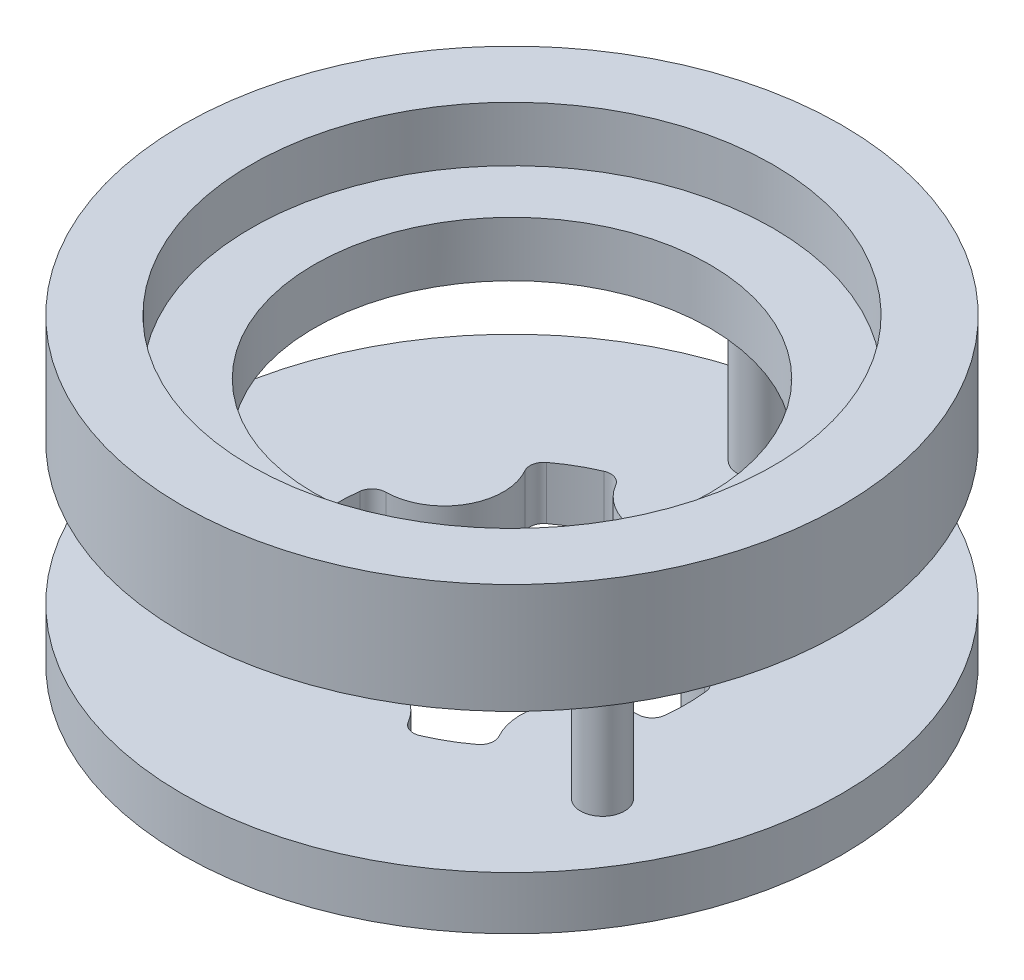
ISO-10303-21;
HEADER;
FILE_DESCRIPTION(('STEP AP214'),'2;1');
FILE_NAME('part.step','',(''),(''),'','','');
FILE_SCHEMA(('AUTOMOTIVE_DESIGN { 1 0 10303 214 1 1 1 1 }'));
ENDSEC;
DATA;
#1=APPLICATION_CONTEXT('core data for automotive mechanical design processes');
#2=APPLICATION_PROTOCOL_DEFINITION('international standard','automotive_design',2000,#1);
#3=PRODUCT_CONTEXT('',#1,'mechanical');
#4=PRODUCT('Part','Part','',(#3));
#5=PRODUCT_RELATED_PRODUCT_CATEGORY('part','',(#4));
#6=PRODUCT_DEFINITION_FORMATION('','',#4);
#7=PRODUCT_DEFINITION_CONTEXT('part definition',#1,'design');
#8=PRODUCT_DEFINITION('design','',#6,#7);
#9=PRODUCT_DEFINITION_SHAPE('','',#8);
#10=(LENGTH_UNIT() NAMED_UNIT(*) SI_UNIT(.MILLI.,.METRE.));
#11=(NAMED_UNIT(*) PLANE_ANGLE_UNIT() SI_UNIT($,.RADIAN.));
#12=(NAMED_UNIT(*) SI_UNIT($,.STERADIAN.) SOLID_ANGLE_UNIT());
#13=UNCERTAINTY_MEASURE_WITH_UNIT(LENGTH_MEASURE(1.E-05),#10,'distance_accuracy_value','');
#14=(GEOMETRIC_REPRESENTATION_CONTEXT(3) GLOBAL_UNCERTAINTY_ASSIGNED_CONTEXT((#13)) GLOBAL_UNIT_ASSIGNED_CONTEXT((#10,
#11,#12)) REPRESENTATION_CONTEXT('',''));
#15=CARTESIAN_POINT('',(0.,0.,0.));
#16=DIRECTION('',(0.,0.,1.));
#17=DIRECTION('',(1.,0.,0.));
#18=AXIS2_PLACEMENT_3D('',#15,#16,#17);
#19=CARTESIAN_POINT('',(0.,55.052,0.));
#20=DIRECTION('',(0.,-1.,0.));
#21=DIRECTION('',(0.,0.,-1.));
#22=AXIS2_PLACEMENT_3D('',#19,#20,#21);
#23=CYLINDRICAL_SURFACE('',#22,36.);
#24=CARTESIAN_POINT('',(0.,35.052,0.));
#25=DIRECTION('',(0.,-1.,0.));
#26=DIRECTION('',(0.,0.,-1.));
#27=AXIS2_PLACEMENT_3D('',#24,#25,#26);
#28=CIRCLE('',#27,36.);
#29=CARTESIAN_POINT('',(0.,35.052,-36.));
#30=VERTEX_POINT('',#29);
#31=EDGE_CURVE('E286',#30,#30,#28,.T.);
#32=ORIENTED_EDGE('',*,*,#31,.T.);
#33=EDGE_LOOP('',(#32));
#34=FACE_BOUND('',#33,.T.);
#35=CARTESIAN_POINT('',(0.,45.052,0.));
#36=DIRECTION('',(0.,1.,0.));
#37=DIRECTION('',(0.,0.,1.));
#38=AXIS2_PLACEMENT_3D('',#35,#36,#37);
#39=CIRCLE('',#38,36.);
#40=CARTESIAN_POINT('',(0.,45.052,36.));
#41=VERTEX_POINT('',#40);
#42=EDGE_CURVE('E282',#41,#41,#39,.F.);
#43=ORIENTED_EDGE('',*,*,#42,.F.);
#44=EDGE_LOOP('',(#43));
#45=FACE_BOUND('',#44,.T.);
#46=ADVANCED_FACE('F45',(#34,#45),#23,.F.);
#47=CARTESIAN_POINT('',(0.,9.652,0.));
#48=DIRECTION('',(0.,-1.,0.));
#49=DIRECTION('',(0.,0.,-1.));
#50=AXIS2_PLACEMENT_3D('',#47,#48,#49);
#51=CYLINDRICAL_SURFACE('',#50,31.7499999999997);
#52=CARTESIAN_POINT('',(0.,0.,0.));
#53=DIRECTION('',(0.,1.,0.));
#54=DIRECTION('',(0.,0.,1.));
#55=AXIS2_PLACEMENT_3D('',#52,#53,#54);
#56=CIRCLE('',#55,31.7499999999997);
#57=CARTESIAN_POINT('',(-19.0652165159659,0.,25.3885804880722));
#58=VERTEX_POINT('',#57);
#59=CARTESIAN_POINT('',(-12.4545474107137,0.,29.2052520755132));
#60=VERTEX_POINT('',#59);
#61=EDGE_CURVE('E474',#58,#60,#56,.T.);
#62=ORIENTED_EDGE('',*,*,#61,.F.);
#63=DIRECTION('',(0.,-1.,0.));
#64=VECTOR('',#63,1.);
#65=CARTESIAN_POINT('',(-19.0652165159659,9.652,25.3885804880723));
#66=LINE('',#65,#64);
#67=CARTESIAN_POINT('',(-19.0652165159659,9.652,25.3885804880722));
#68=VERTEX_POINT('',#67);
#69=EDGE_CURVE('E307',#58,#68,#66,.F.);
#70=ORIENTED_EDGE('',*,*,#69,.T.);
#71=CARTESIAN_POINT('',(0.,9.652,0.));
#72=DIRECTION('',(0.,1.,0.));
#73=DIRECTION('',(0.,0.,1.));
#74=AXIS2_PLACEMENT_3D('',#71,#72,#73);
#75=CIRCLE('',#74,31.7499999999997);
#76=CARTESIAN_POINT('',(-12.4545474107137,9.652,29.2052520755132));
#77=VERTEX_POINT('',#76);
#78=EDGE_CURVE('E281',#68,#77,#75,.T.);
#79=ORIENTED_EDGE('',*,*,#78,.T.);
#80=DIRECTION('',(0.,-1.,0.));
#81=VECTOR('',#80,1.);
#82=CARTESIAN_POINT('',(-12.4545474107137,9.652,29.2052520755132));
#83=LINE('',#82,#81);
#84=EDGE_CURVE('E303',#77,#60,#83,.T.);
#85=ORIENTED_EDGE('',*,*,#84,.T.);
#86=EDGE_LOOP('',(#62,#70,#79,#85));
#87=FACE_BOUND('',#86,.T.);
#88=ADVANCED_FACE('F580',(#87),#51,.F.);
#89=CARTESIAN_POINT('',(-29.1143354501116,9.652,16.8091694093988));
#90=DIRECTION('',(0.,-1.,0.));
#91=DIRECTION('',(0.,0.,-1.));
#92=AXIS2_PLACEMENT_3D('',#89,#90,#91);
#93=CYLINDRICAL_SURFACE('',#92,10.7583388187981);
#94=CARTESIAN_POINT('',(-29.1143354501116,0.,16.8091694093988));
#95=DIRECTION('',(0.,1.,0.));
#96=DIRECTION('',(0.,0.,1.));
#97=AXIS2_PLACEMENT_3D('',#94,#95,#96);
#98=CIRCLE('',#97,10.7583388187981);
#99=CARTESIAN_POINT('',(-19.7507124641699,0.,22.1067555311341));
#100=VERTEX_POINT('',#99);
#101=CARTESIAN_POINT('',(-29.0203681172994,0.,6.05124097124576));
#102=VERTEX_POINT('',#101);
#103=EDGE_CURVE('E246',#100,#102,#98,.T.);
#104=ORIENTED_EDGE('',*,*,#103,.T.);
#105=DIRECTION('',(0.,-1.,0.));
#106=VECTOR('',#105,1.);
#107=CARTESIAN_POINT('',(-29.0203681172994,9.652,6.05124097124576));
#108=LINE('',#107,#106);
#109=CARTESIAN_POINT('',(-29.0203681172994,9.652,6.05124097124576));
#110=VERTEX_POINT('',#109);
#111=EDGE_CURVE('E300',#102,#110,#108,.F.);
#112=ORIENTED_EDGE('',*,*,#111,.T.);
#113=CARTESIAN_POINT('',(-29.1143354501116,9.652,16.8091694093988));
#114=DIRECTION('',(0.,1.,0.));
#115=DIRECTION('',(0.,0.,1.));
#116=AXIS2_PLACEMENT_3D('',#113,#114,#115);
#117=CIRCLE('',#116,10.7583388187981);
#118=CARTESIAN_POINT('',(-19.7507124641699,9.652,22.1067555311341));
#119=VERTEX_POINT('',#118);
#120=EDGE_CURVE('E493',#119,#110,#117,.T.);
#121=ORIENTED_EDGE('',*,*,#120,.F.);
#122=DIRECTION('',(0.,-1.,0.));
#123=VECTOR('',#122,1.);
#124=CARTESIAN_POINT('',(-19.7507124641699,9.652,22.1067555311341));
#125=LINE('',#124,#123);
#126=EDGE_CURVE('E296',#119,#100,#125,.T.);
#127=ORIENTED_EDGE('',*,*,#126,.T.);
#128=EDGE_LOOP('',(#104,#112,#121,#127));
#129=FACE_BOUND('',#128,.T.);
#130=ADVANCED_FACE('F482',(#129),#93,.T.);
#131=CARTESIAN_POINT('',(0.,9.652,0.));
#132=DIRECTION('',(0.,-1.,0.));
#133=DIRECTION('',(0.,0.,-1.));
#134=AXIS2_PLACEMENT_3D('',#131,#132,#133);
#135=CYLINDRICAL_SURFACE('',#134,31.7499999999999);
#136=CARTESIAN_POINT('',(0.,0.,0.));
#137=DIRECTION('',(0.,1.,0.));
#138=DIRECTION('',(0.,0.,1.));
#139=AXIS2_PLACEMENT_3D('',#136,#137,#138);
#140=CIRCLE('',#139,31.7499999999999);
#141=CARTESIAN_POINT('',(-31.5197639266796,0.,3.81667158744073));
#142=VERTEX_POINT('',#141);
#143=CARTESIAN_POINT('',(-31.5197639266796,0.,-3.81667158744095));
#144=VERTEX_POINT('',#143);
#145=EDGE_CURVE('E240',#142,#144,#140,.F.);
#146=ORIENTED_EDGE('',*,*,#145,.T.);
#147=DIRECTION('',(0.,-1.,0.));
#148=VECTOR('',#147,1.);
#149=CARTESIAN_POINT('',(-31.5197639266796,9.652,-3.81667158744095));
#150=LINE('',#149,#148);
#151=CARTESIAN_POINT('',(-31.5197639266796,9.652,-3.81667158744095));
#152=VERTEX_POINT('',#151);
#153=EDGE_CURVE('E213',#144,#152,#150,.F.);
#154=ORIENTED_EDGE('',*,*,#153,.T.);
#155=CARTESIAN_POINT('',(0.,9.652,0.));
#156=DIRECTION('',(0.,1.,0.));
#157=DIRECTION('',(0.,0.,1.));
#158=AXIS2_PLACEMENT_3D('',#155,#156,#157);
#159=CIRCLE('',#158,31.7499999999999);
#160=CARTESIAN_POINT('',(-31.5197639266796,9.652,3.81667158744073));
#161=VERTEX_POINT('',#160);
#162=EDGE_CURVE('E492',#161,#152,#159,.F.);
#163=ORIENTED_EDGE('',*,*,#162,.F.);
#164=DIRECTION('',(0.,-1.,0.));
#165=VECTOR('',#164,1.);
#166=CARTESIAN_POINT('',(-31.5197639266796,9.652,3.81667158744073));
#167=LINE('',#166,#165);
#168=EDGE_CURVE('E230',#161,#142,#167,.T.);
#169=ORIENTED_EDGE('',*,*,#168,.T.);
#170=EDGE_LOOP('',(#146,#154,#163,#169));
#171=FACE_BOUND('',#170,.T.);
#172=ADVANCED_FACE('F495',(#171),#135,.F.);
#173=CARTESIAN_POINT('',(-29.1143354501117,9.652,-16.809169409399));
#174=DIRECTION('',(0.,-1.,0.));
#175=DIRECTION('',(0.,0.,-1.));
#176=AXIS2_PLACEMENT_3D('',#173,#174,#175);
#177=CYLINDRICAL_SURFACE('',#176,10.7583388187981);
#178=CARTESIAN_POINT('',(-29.1143354501117,9.652,-16.809169409399));
#179=DIRECTION('',(0.,1.,0.));
#180=DIRECTION('',(0.,0.,1.));
#181=AXIS2_PLACEMENT_3D('',#178,#179,#180);
#182=CIRCLE('',#181,10.7583388187981);
#183=CARTESIAN_POINT('',(-29.0203681172994,9.652,-6.05124097124596));
#184=VERTEX_POINT('',#183);
#185=CARTESIAN_POINT('',(-19.75071246417,9.652,-22.1067555311343));
#186=VERTEX_POINT('',#185);
#187=EDGE_CURVE('E228',#184,#186,#182,.T.);
#188=ORIENTED_EDGE('',*,*,#187,.F.);
#189=DIRECTION('',(0.,-1.,0.));
#190=VECTOR('',#189,1.);
#191=CARTESIAN_POINT('',(-29.0203681172994,9.652,-6.05124097124596));
#192=LINE('',#191,#190);
#193=CARTESIAN_POINT('',(-29.0203681172994,0.,-6.05124097124596));
#194=VERTEX_POINT('',#193);
#195=EDGE_CURVE('E212',#184,#194,#192,.T.);
#196=ORIENTED_EDGE('',*,*,#195,.T.);
#197=CARTESIAN_POINT('',(-29.1143354501117,0.,-16.809169409399));
#198=DIRECTION('',(0.,1.,0.));
#199=DIRECTION('',(0.,0.,1.));
#200=AXIS2_PLACEMENT_3D('',#197,#198,#199);
#201=CIRCLE('',#200,10.7583388187981);
#202=CARTESIAN_POINT('',(-19.75071246417,0.,-22.1067555311343));
#203=VERTEX_POINT('',#202);
#204=EDGE_CURVE('E226',#194,#203,#201,.T.);
#205=ORIENTED_EDGE('',*,*,#204,.T.);
#206=DIRECTION('',(0.,-1.,0.));
#207=VECTOR('',#206,1.);
#208=CARTESIAN_POINT('',(-19.75071246417,9.652,-22.1067555311343));
#209=LINE('',#208,#207);
#210=EDGE_CURVE('E231',#203,#186,#209,.F.);
#211=ORIENTED_EDGE('',*,*,#210,.T.);
#212=EDGE_LOOP('',(#188,#196,#205,#211));
#213=FACE_BOUND('',#212,.T.);
#214=ADVANCED_FACE('F225',(#213),#177,.T.);
#215=CARTESIAN_POINT('',(0.,9.652,0.));
#216=DIRECTION('',(0.,-1.,0.));
#217=DIRECTION('',(0.,0.,-1.));
#218=AXIS2_PLACEMENT_3D('',#215,#216,#217);
#219=CYLINDRICAL_SURFACE('',#218,31.75);
#220=CARTESIAN_POINT('',(0.,9.652,0.));
#221=DIRECTION('',(0.,1.,0.));
#222=DIRECTION('',(0.,0.,1.));
#223=AXIS2_PLACEMENT_3D('',#220,#221,#222);
#224=CIRCLE('',#223,31.75);
#225=CARTESIAN_POINT('',(-19.065216515966,9.652,-25.3885804880725));
#226=VERTEX_POINT('',#225);
#227=CARTESIAN_POINT('',(-12.4545474107137,9.652,-29.2052520755135));
#228=VERTEX_POINT('',#227);
#229=EDGE_CURVE('E437',#226,#228,#224,.F.);
#230=ORIENTED_EDGE('',*,*,#229,.F.);
#231=DIRECTION('',(0.,-1.,0.));
#232=VECTOR('',#231,1.);
#233=CARTESIAN_POINT('',(-19.065216515966,9.652,-25.3885804880725));
#234=LINE('',#233,#232);
#235=CARTESIAN_POINT('',(-19.065216515966,0.,-25.3885804880725));
#236=VERTEX_POINT('',#235);
#237=EDGE_CURVE('E220',#226,#236,#234,.T.);
#238=ORIENTED_EDGE('',*,*,#237,.T.);
#239=CARTESIAN_POINT('',(0.,0.,0.));
#240=DIRECTION('',(0.,1.,0.));
#241=DIRECTION('',(0.,0.,1.));
#242=AXIS2_PLACEMENT_3D('',#239,#240,#241);
#243=CIRCLE('',#242,31.75);
#244=CARTESIAN_POINT('',(-12.4545474107137,0.,-29.2052520755135));
#245=VERTEX_POINT('',#244);
#246=EDGE_CURVE('E239',#236,#245,#243,.F.);
#247=ORIENTED_EDGE('',*,*,#246,.T.);
#248=DIRECTION('',(0.,-1.,0.));
#249=VECTOR('',#248,1.);
#250=CARTESIAN_POINT('',(-12.4545474107137,9.652,-29.2052520755135));
#251=LINE('',#250,#249);
#252=EDGE_CURVE('E61',#245,#228,#251,.F.);
#253=ORIENTED_EDGE('',*,*,#252,.T.);
#254=EDGE_LOOP('',(#230,#238,#247,#253));
#255=FACE_BOUND('',#254,.T.);
#256=ADVANCED_FACE('F427',(#255),#219,.F.);
#257=CARTESIAN_POINT('',(0.,9.652,-33.6183388187981));
#258=DIRECTION('',(0.,-1.,0.));
#259=DIRECTION('',(0.,0.,-1.));
#260=AXIS2_PLACEMENT_3D('',#257,#258,#259);
#261=CYLINDRICAL_SURFACE('',#260,10.7583388187981);
#262=CARTESIAN_POINT('',(0.,0.,-33.6183388187981));
#263=DIRECTION('',(0.,1.,0.));
#264=DIRECTION('',(0.,0.,1.));
#265=AXIS2_PLACEMENT_3D('',#262,#263,#264);
#266=CIRCLE('',#265,10.7583388187981);
#267=CARTESIAN_POINT('',(-9.26965565312948,0.,-28.1579965023803));
#268=VERTEX_POINT('',#267);
#269=CARTESIAN_POINT('',(9.26965565312947,0.,-28.1579965023803));
#270=VERTEX_POINT('',#269);
#271=EDGE_CURVE('E244',#268,#270,#266,.T.);
#272=ORIENTED_EDGE('',*,*,#271,.T.);
#273=DIRECTION('',(0.,-1.,0.));
#274=VECTOR('',#273,1.);
#275=CARTESIAN_POINT('',(9.26965565312947,9.652,-28.1579965023803));
#276=LINE('',#275,#274);
#277=CARTESIAN_POINT('',(9.26965565312947,9.652,-28.1579965023803));
#278=VERTEX_POINT('',#277);
#279=EDGE_CURVE('E356',#270,#278,#276,.F.);
#280=ORIENTED_EDGE('',*,*,#279,.T.);
#281=CARTESIAN_POINT('',(0.,9.652,-33.6183388187981));
#282=DIRECTION('',(0.,1.,0.));
#283=DIRECTION('',(0.,0.,1.));
#284=AXIS2_PLACEMENT_3D('',#281,#282,#283);
#285=CIRCLE('',#284,10.7583388187981);
#286=CARTESIAN_POINT('',(-9.26965565312948,9.652,-28.1579965023803));
#287=VERTEX_POINT('',#286);
#288=EDGE_CURVE('E435',#287,#278,#285,.T.);
#289=ORIENTED_EDGE('',*,*,#288,.F.);
#290=DIRECTION('',(0.,-1.,0.));
#291=VECTOR('',#290,1.);
#292=CARTESIAN_POINT('',(-9.26965565312948,9.652,-28.1579965023803));
#293=LINE('',#292,#291);
#294=EDGE_CURVE('E352',#287,#268,#293,.T.);
#295=ORIENTED_EDGE('',*,*,#294,.T.);
#296=EDGE_LOOP('',(#272,#280,#289,#295));
#297=FACE_BOUND('',#296,.T.);
#298=ADVANCED_FACE('F439',(#297),#261,.T.);
#299=CARTESIAN_POINT('',(0.,9.652,0.));
#300=DIRECTION('',(0.,-1.,0.));
#301=DIRECTION('',(0.,0.,-1.));
#302=AXIS2_PLACEMENT_3D('',#299,#300,#301);
#303=CYLINDRICAL_SURFACE('',#302,31.75);
#304=CARTESIAN_POINT('',(0.,0.,0.));
#305=DIRECTION('',(0.,1.,0.));
#306=DIRECTION('',(0.,0.,1.));
#307=AXIS2_PLACEMENT_3D('',#304,#305,#306);
#308=CIRCLE('',#307,31.75);
#309=CARTESIAN_POINT('',(12.4545474107137,0.,-29.2052520755135));
#310=VERTEX_POINT('',#309);
#311=CARTESIAN_POINT('',(19.0652165159659,0.,-25.3885804880726));
#312=VERTEX_POINT('',#311);
#313=EDGE_CURVE('E253',#310,#312,#308,.F.);
#314=ORIENTED_EDGE('',*,*,#313,.T.);
#315=DIRECTION('',(0.,-1.,0.));
#316=VECTOR('',#315,1.);
#317=CARTESIAN_POINT('',(19.0652165159659,9.652,-25.3885804880726));
#318=LINE('',#317,#316);
#319=CARTESIAN_POINT('',(19.0652165159659,9.652,-25.3885804880726));
#320=VERTEX_POINT('',#319);
#321=EDGE_CURVE('E349',#312,#320,#318,.F.);
#322=ORIENTED_EDGE('',*,*,#321,.T.);
#323=CARTESIAN_POINT('',(0.,9.652,0.));
#324=DIRECTION('',(0.,1.,0.));
#325=DIRECTION('',(0.,0.,1.));
#326=AXIS2_PLACEMENT_3D('',#323,#324,#325);
#327=CIRCLE('',#326,31.75);
#328=CARTESIAN_POINT('',(12.4545474107137,9.652,-29.2052520755135));
#329=VERTEX_POINT('',#328);
#330=EDGE_CURVE('E442',#329,#320,#327,.F.);
#331=ORIENTED_EDGE('',*,*,#330,.F.);
#332=DIRECTION('',(0.,-1.,0.));
#333=VECTOR('',#332,1.);
#334=CARTESIAN_POINT('',(12.4545474107137,9.652,-29.2052520755135));
#335=LINE('',#334,#333);
#336=EDGE_CURVE('E345',#329,#310,#335,.T.);
#337=ORIENTED_EDGE('',*,*,#336,.T.);
#338=EDGE_LOOP('',(#314,#322,#331,#337));
#339=FACE_BOUND('',#338,.T.);
#340=ADVANCED_FACE('F796',(#339),#303,.F.);
#341=CARTESIAN_POINT('',(29.1143354501115,9.652,-16.8091694093991));
#342=DIRECTION('',(0.,-1.,0.));
#343=DIRECTION('',(0.,0.,-1.));
#344=AXIS2_PLACEMENT_3D('',#341,#342,#343);
#345=CYLINDRICAL_SURFACE('',#344,10.7583388187981);
#346=CARTESIAN_POINT('',(29.1143354501115,0.,-16.8091694093991));
#347=DIRECTION('',(0.,1.,0.));
#348=DIRECTION('',(0.,0.,1.));
#349=AXIS2_PLACEMENT_3D('',#346,#347,#348);
#350=CIRCLE('',#349,10.7583388187981);
#351=CARTESIAN_POINT('',(19.7507124641698,0.,-22.1067555311344));
#352=VERTEX_POINT('',#351);
#353=CARTESIAN_POINT('',(29.0203681172993,0.,-6.05124097124607));
#354=VERTEX_POINT('',#353);
#355=EDGE_CURVE('E257',#352,#354,#350,.T.);
#356=ORIENTED_EDGE('',*,*,#355,.T.);
#357=DIRECTION('',(0.,-1.,0.));
#358=VECTOR('',#357,1.);
#359=CARTESIAN_POINT('',(29.0203681172993,9.652,-6.05124097124607));
#360=LINE('',#359,#358);
#361=CARTESIAN_POINT('',(29.0203681172993,9.652,-6.05124097124607));
#362=VERTEX_POINT('',#361);
#363=EDGE_CURVE('E342',#354,#362,#360,.F.);
#364=ORIENTED_EDGE('',*,*,#363,.T.);
#365=CARTESIAN_POINT('',(29.1143354501115,9.652,-16.8091694093991));
#366=DIRECTION('',(0.,1.,0.));
#367=DIRECTION('',(0.,0.,1.));
#368=AXIS2_PLACEMENT_3D('',#365,#366,#367);
#369=CIRCLE('',#368,10.7583388187981);
#370=CARTESIAN_POINT('',(19.7507124641698,9.652,-22.1067555311344));
#371=VERTEX_POINT('',#370);
#372=EDGE_CURVE('E447',#371,#362,#369,.T.);
#373=ORIENTED_EDGE('',*,*,#372,.F.);
#374=DIRECTION('',(0.,-1.,0.));
#375=VECTOR('',#374,1.);
#376=CARTESIAN_POINT('',(19.7507124641698,9.652,-22.1067555311344));
#377=LINE('',#376,#375);
#378=EDGE_CURVE('E338',#371,#352,#377,.T.);
#379=ORIENTED_EDGE('',*,*,#378,.T.);
#380=EDGE_LOOP('',(#356,#364,#373,#379));
#381=FACE_BOUND('',#380,.T.);
#382=ADVANCED_FACE('F785',(#381),#345,.T.);
#383=CARTESIAN_POINT('',(0.,9.652,0.));
#384=DIRECTION('',(0.,-1.,0.));
#385=DIRECTION('',(0.,0.,-1.));
#386=AXIS2_PLACEMENT_3D('',#383,#384,#385);
#387=CYLINDRICAL_SURFACE('',#386,31.7499999999998);
#388=CARTESIAN_POINT('',(0.,0.,0.));
#389=DIRECTION('',(0.,1.,0.));
#390=DIRECTION('',(0.,0.,1.));
#391=AXIS2_PLACEMENT_3D('',#388,#389,#390);
#392=CIRCLE('',#391,31.7499999999998);
#393=CARTESIAN_POINT('',(31.5197639266796,0.,-3.81667158744106));
#394=VERTEX_POINT('',#393);
#395=CARTESIAN_POINT('',(31.5197639266796,0.,3.81667158744075));
#396=VERTEX_POINT('',#395);
#397=EDGE_CURVE('E261',#394,#396,#392,.F.);
#398=ORIENTED_EDGE('',*,*,#397,.T.);
#399=DIRECTION('',(0.,-1.,0.));
#400=VECTOR('',#399,1.);
#401=CARTESIAN_POINT('',(31.5197639266796,9.652,3.81667158744075));
#402=LINE('',#401,#400);
#403=CARTESIAN_POINT('',(31.5197639266796,9.652,3.81667158744075));
#404=VERTEX_POINT('',#403);
#405=EDGE_CURVE('E335',#396,#404,#402,.F.);
#406=ORIENTED_EDGE('',*,*,#405,.T.);
#407=CARTESIAN_POINT('',(0.,9.652,0.));
#408=DIRECTION('',(0.,1.,0.));
#409=DIRECTION('',(0.,0.,1.));
#410=AXIS2_PLACEMENT_3D('',#407,#408,#409);
#411=CIRCLE('',#410,31.7499999999998);
#412=CARTESIAN_POINT('',(31.5197639266796,9.652,-3.81667158744106));
#413=VERTEX_POINT('',#412);
#414=EDGE_CURVE('E455',#413,#404,#411,.F.);
#415=ORIENTED_EDGE('',*,*,#414,.F.);
#416=DIRECTION('',(0.,-1.,0.));
#417=VECTOR('',#416,1.);
#418=CARTESIAN_POINT('',(31.5197639266796,9.652,-3.81667158744106));
#419=LINE('',#418,#417);
#420=EDGE_CURVE('E331',#413,#394,#419,.T.);
#421=ORIENTED_EDGE('',*,*,#420,.T.);
#422=EDGE_LOOP('',(#398,#406,#415,#421));
#423=FACE_BOUND('',#422,.T.);
#424=ADVANCED_FACE('F774',(#423),#387,.F.);
#425=CARTESIAN_POINT('',(29.1143354501115,9.652,16.8091694093988));
#426=DIRECTION('',(0.,-1.,0.));
#427=DIRECTION('',(0.,0.,-1.));
#428=AXIS2_PLACEMENT_3D('',#425,#426,#427);
#429=CYLINDRICAL_SURFACE('',#428,10.7583388187981);
#430=CARTESIAN_POINT('',(29.1143354501115,0.,16.8091694093988));
#431=DIRECTION('',(0.,1.,0.));
#432=DIRECTION('',(0.,0.,1.));
#433=AXIS2_PLACEMENT_3D('',#430,#431,#432);
#434=CIRCLE('',#433,10.7583388187981);
#435=CARTESIAN_POINT('',(29.0203681172993,0.,6.05124097124578));
#436=VERTEX_POINT('',#435);
#437=CARTESIAN_POINT('',(19.7507124641698,0.,22.1067555311341));
#438=VERTEX_POINT('',#437);
#439=EDGE_CURVE('E265',#436,#438,#434,.T.);
#440=ORIENTED_EDGE('',*,*,#439,.T.);
#441=DIRECTION('',(0.,-1.,0.));
#442=VECTOR('',#441,1.);
#443=CARTESIAN_POINT('',(19.7507124641698,9.652,22.1067555311341));
#444=LINE('',#443,#442);
#445=CARTESIAN_POINT('',(19.7507124641698,9.652,22.1067555311341));
#446=VERTEX_POINT('',#445);
#447=EDGE_CURVE('E328',#438,#446,#444,.F.);
#448=ORIENTED_EDGE('',*,*,#447,.T.);
#449=CARTESIAN_POINT('',(29.1143354501115,9.652,16.8091694093988));
#450=DIRECTION('',(0.,1.,0.));
#451=DIRECTION('',(0.,0.,1.));
#452=AXIS2_PLACEMENT_3D('',#449,#450,#451);
#453=CIRCLE('',#452,10.7583388187981);
#454=CARTESIAN_POINT('',(29.0203681172993,9.652,6.05124097124578));
#455=VERTEX_POINT('',#454);
#456=EDGE_CURVE('E459',#455,#446,#453,.T.);
#457=ORIENTED_EDGE('',*,*,#456,.F.);
#458=DIRECTION('',(0.,-1.,0.));
#459=VECTOR('',#458,1.);
#460=CARTESIAN_POINT('',(29.0203681172993,9.652,6.05124097124578));
#461=LINE('',#460,#459);
#462=EDGE_CURVE('E324',#455,#436,#461,.T.);
#463=ORIENTED_EDGE('',*,*,#462,.T.);
#464=EDGE_LOOP('',(#440,#448,#457,#463));
#465=FACE_BOUND('',#464,.T.);
#466=ADVANCED_FACE('F763',(#465),#429,.T.);
#467=CARTESIAN_POINT('',(0.,9.652,0.));
#468=DIRECTION('',(0.,-1.,0.));
#469=DIRECTION('',(0.,0.,-1.));
#470=AXIS2_PLACEMENT_3D('',#467,#468,#469);
#471=CYLINDRICAL_SURFACE('',#470,31.7499999999997);
#472=CARTESIAN_POINT('',(0.,0.,0.));
#473=DIRECTION('',(0.,1.,0.));
#474=DIRECTION('',(0.,0.,1.));
#475=AXIS2_PLACEMENT_3D('',#472,#473,#474);
#476=CIRCLE('',#475,31.7499999999997);
#477=CARTESIAN_POINT('',(19.0652165159659,0.,25.3885804880723));
#478=VERTEX_POINT('',#477);
#479=CARTESIAN_POINT('',(12.4545474107137,0.,29.2052520755132));
#480=VERTEX_POINT('',#479);
#481=EDGE_CURVE('E269',#478,#480,#476,.F.);
#482=ORIENTED_EDGE('',*,*,#481,.T.);
#483=DIRECTION('',(0.,-1.,0.));
#484=VECTOR('',#483,1.);
#485=CARTESIAN_POINT('',(12.4545474107137,9.652,29.2052520755132));
#486=LINE('',#485,#484);
#487=CARTESIAN_POINT('',(12.4545474107137,9.652,29.2052520755132));
#488=VERTEX_POINT('',#487);
#489=EDGE_CURVE('E321',#480,#488,#486,.F.);
#490=ORIENTED_EDGE('',*,*,#489,.T.);
#491=CARTESIAN_POINT('',(0.,9.652,0.));
#492=DIRECTION('',(0.,1.,0.));
#493=DIRECTION('',(0.,0.,1.));
#494=AXIS2_PLACEMENT_3D('',#491,#492,#493);
#495=CIRCLE('',#494,31.7499999999997);
#496=CARTESIAN_POINT('',(19.0652165159659,9.652,25.3885804880723));
#497=VERTEX_POINT('',#496);
#498=EDGE_CURVE('E463',#497,#488,#495,.F.);
#499=ORIENTED_EDGE('',*,*,#498,.F.);
#500=DIRECTION('',(0.,-1.,0.));
#501=VECTOR('',#500,1.);
#502=CARTESIAN_POINT('',(19.0652165159659,9.652,25.3885804880723));
#503=LINE('',#502,#501);
#504=EDGE_CURVE('E317',#497,#478,#503,.T.);
#505=ORIENTED_EDGE('',*,*,#504,.T.);
#506=EDGE_LOOP('',(#482,#490,#499,#505));
#507=FACE_BOUND('',#506,.T.);
#508=ADVANCED_FACE('F752',(#507),#471,.F.);
#509=CARTESIAN_POINT('',(0.,9.652,33.6183388187978));
#510=DIRECTION('',(0.,-1.,0.));
#511=DIRECTION('',(0.,0.,-1.));
#512=AXIS2_PLACEMENT_3D('',#509,#510,#511);
#513=CYLINDRICAL_SURFACE('',#512,10.7583388187981);
#514=CARTESIAN_POINT('',(0.,0.,33.6183388187978));
#515=DIRECTION('',(0.,1.,0.));
#516=DIRECTION('',(0.,0.,1.));
#517=AXIS2_PLACEMENT_3D('',#514,#515,#516);
#518=CIRCLE('',#517,10.7583388187981);
#519=CARTESIAN_POINT('',(9.26965565312945,0.,28.15799650238));
#520=VERTEX_POINT('',#519);
#521=CARTESIAN_POINT('',(-9.26965565312951,0.,28.15799650238));
#522=VERTEX_POINT('',#521);
#523=EDGE_CURVE('E273',#520,#522,#518,.T.);
#524=ORIENTED_EDGE('',*,*,#523,.T.);
#525=DIRECTION('',(0.,-1.,0.));
#526=VECTOR('',#525,1.);
#527=CARTESIAN_POINT('',(-9.26965565312951,9.652,28.15799650238));
#528=LINE('',#527,#526);
#529=CARTESIAN_POINT('',(-9.26965565312951,9.652,28.15799650238));
#530=VERTEX_POINT('',#529);
#531=EDGE_CURVE('E314',#522,#530,#528,.F.);
#532=ORIENTED_EDGE('',*,*,#531,.T.);
#533=CARTESIAN_POINT('',(0.,9.652,33.6183388187978));
#534=DIRECTION('',(0.,1.,0.));
#535=DIRECTION('',(0.,0.,1.));
#536=AXIS2_PLACEMENT_3D('',#533,#534,#535);
#537=CIRCLE('',#536,10.7583388187981);
#538=CARTESIAN_POINT('',(9.26965565312945,9.652,28.15799650238));
#539=VERTEX_POINT('',#538);
#540=EDGE_CURVE('E467',#539,#530,#537,.T.);
#541=ORIENTED_EDGE('',*,*,#540,.F.);
#542=DIRECTION('',(0.,-1.,0.));
#543=VECTOR('',#542,1.);
#544=CARTESIAN_POINT('',(9.26965565312945,9.652,28.15799650238));
#545=LINE('',#544,#543);
#546=EDGE_CURVE('E310',#539,#520,#545,.T.);
#547=ORIENTED_EDGE('',*,*,#546,.T.);
#548=EDGE_LOOP('',(#524,#532,#541,#547));
#549=FACE_BOUND('',#548,.T.);
#550=ADVANCED_FACE('F747',(#549),#513,.T.);
#551=CARTESIAN_POINT('',(0.,9.652,0.));
#552=DIRECTION('',(0.,-1.,0.));
#553=DIRECTION('',(0.,0.,-1.));
#554=AXIS2_PLACEMENT_3D('',#551,#552,#553);
#555=CYLINDRICAL_SURFACE('',#554,60.);
#556=CARTESIAN_POINT('',(0.,9.652,0.));
#557=DIRECTION('',(0.,1.,0.));
#558=DIRECTION('',(0.,0.,1.));
#559=AXIS2_PLACEMENT_3D('',#556,#557,#558);
#560=CIRCLE('',#559,60.);
#561=CARTESIAN_POINT('',(0.,9.652,60.));
#562=VERTEX_POINT('',#561);
#563=EDGE_CURVE('E289',#562,#562,#560,.T.);
#564=ORIENTED_EDGE('',*,*,#563,.F.);
#565=EDGE_LOOP('',(#564));
#566=FACE_BOUND('',#565,.T.);
#567=CARTESIAN_POINT('',(0.,0.,0.));
#568=DIRECTION('',(0.,1.,0.));
#569=DIRECTION('',(0.,0.,1.));
#570=AXIS2_PLACEMENT_3D('',#567,#568,#569);
#571=CIRCLE('',#570,60.);
#572=CARTESIAN_POINT('',(0.,0.,60.));
#573=VERTEX_POINT('',#572);
#574=EDGE_CURVE('E277',#573,#573,#571,.T.);
#575=ORIENTED_EDGE('',*,*,#574,.T.);
#576=EDGE_LOOP('',(#575));
#577=FACE_BOUND('',#576,.T.);
#578=ADVANCED_FACE('F738',(#566,#577),#555,.T.);
#579=CARTESIAN_POINT('',(0.,9.652,0.));
#580=DIRECTION('',(0.,1.,0.));
#581=DIRECTION('',(0.,0.,1.));
#582=AXIS2_PLACEMENT_3D('',#579,#580,#581);
#583=PLANE('',#582);
#584=CARTESIAN_POINT('',(-38.9711431702923,9.652,22.5000000000043));
#585=DIRECTION('',(0.,1.,0.));
#586=DIRECTION('',(0.,0.,1.));
#587=AXIS2_PLACEMENT_3D('',#584,#585,#586);
#588=CIRCLE('',#587,4.00000000000001);
#589=CARTESIAN_POINT('',(-38.9711431702923,9.652,26.5000000000043));
#590=VERTEX_POINT('',#589);
#591=EDGE_CURVE('E521',#590,#590,#588,.T.);
#592=ORIENTED_EDGE('',*,*,#591,.F.);
#593=EDGE_LOOP('',(#592));
#594=FACE_BOUND('',#593,.T.);
#595=CARTESIAN_POINT('',(38.9711431703072,9.652,22.4999999999957));
#596=DIRECTION('',(0.,1.,0.));
#597=DIRECTION('',(0.,0.,1.));
#598=AXIS2_PLACEMENT_3D('',#595,#596,#597);
#599=CIRCLE('',#598,4.00000000000001);
#600=CARTESIAN_POINT('',(38.9711431703072,9.652,26.4999999999957));
#601=VERTEX_POINT('',#600);
#602=EDGE_CURVE('E513',#601,#601,#599,.T.);
#603=ORIENTED_EDGE('',*,*,#602,.F.);
#604=EDGE_LOOP('',(#603));
#605=FACE_BOUND('',#604,.T.);
#606=CARTESIAN_POINT('',(0.,9.652,-45.));
#607=DIRECTION('',(0.,1.,0.));
#608=DIRECTION('',(0.,0.,1.));
#609=AXIS2_PLACEMENT_3D('',#606,#607,#608);
#610=CIRCLE('',#609,4.);
#611=CARTESIAN_POINT('',(0.,9.652,-41.));
#612=VERTEX_POINT('',#611);
#613=EDGE_CURVE('E505',#612,#612,#610,.T.);
#614=ORIENTED_EDGE('',*,*,#613,.F.);
#615=EDGE_LOOP('',(#614));
#616=FACE_BOUND('',#615,.T.);
#617=ORIENTED_EDGE('',*,*,#78,.F.);
#618=CARTESIAN_POINT('',(-17.5399991946886,9.652,23.3574940490264));
#619=DIRECTION('',(0.,1.,0.));
#620=DIRECTION('',(0.,0.,1.));
#621=AXIS2_PLACEMENT_3D('',#618,#619,#620);
#622=CIRCLE('',#621,2.54);
#623=EDGE_CURVE('E375',#68,#119,#622,.F.);
#624=ORIENTED_EDGE('',*,*,#623,.T.);
#625=ORIENTED_EDGE('',*,*,#120,.T.);
#626=CARTESIAN_POINT('',(-28.9981828125453,9.652,3.51133786044547));
#627=DIRECTION('',(0.,1.,0.));
#628=DIRECTION('',(0.,0.,1.));
#629=AXIS2_PLACEMENT_3D('',#626,#627,#628);
#630=CIRCLE('',#629,2.54);
#631=EDGE_CURVE('E369',#110,#161,#630,.F.);
#632=ORIENTED_EDGE('',*,*,#631,.T.);
#633=ORIENTED_EDGE('',*,*,#162,.T.);
#634=CARTESIAN_POINT('',(-28.9981828125452,9.652,-3.51133786044567));
#635=DIRECTION('',(0.,1.,0.));
#636=DIRECTION('',(0.,0.,1.));
#637=AXIS2_PLACEMENT_3D('',#634,#635,#636);
#638=CIRCLE('',#637,2.54);
#639=EDGE_CURVE('E219',#152,#184,#638,.F.);
#640=ORIENTED_EDGE('',*,*,#639,.T.);
#641=ORIENTED_EDGE('',*,*,#187,.T.);
#642=CARTESIAN_POINT('',(-17.5399991946888,9.652,-23.3574940490267));
#643=DIRECTION('',(0.,1.,0.));
#644=DIRECTION('',(0.,0.,1.));
#645=AXIS2_PLACEMENT_3D('',#642,#643,#644);
#646=CIRCLE('',#645,2.54);
#647=EDGE_CURVE('E68',#186,#226,#646,.F.);
#648=ORIENTED_EDGE('',*,*,#647,.T.);
#649=ORIENTED_EDGE('',*,*,#229,.T.);
#650=CARTESIAN_POINT('',(-11.4581836178566,9.652,-26.8688319094724));
#651=DIRECTION('',(0.,1.,0.));
#652=DIRECTION('',(0.,0.,1.));
#653=AXIS2_PLACEMENT_3D('',#650,#651,#652);
#654=CIRCLE('',#653,2.54);
#655=EDGE_CURVE('E11',#228,#287,#654,.F.);
#656=ORIENTED_EDGE('',*,*,#655,.T.);
#657=ORIENTED_EDGE('',*,*,#288,.T.);
#658=CARTESIAN_POINT('',(11.4581836178566,9.652,-26.8688319094724));
#659=DIRECTION('',(0.,1.,0.));
#660=DIRECTION('',(0.,0.,1.));
#661=AXIS2_PLACEMENT_3D('',#658,#659,#660);
#662=CIRCLE('',#661,2.54);
#663=EDGE_CURVE('E417',#278,#329,#662,.F.);
#664=ORIENTED_EDGE('',*,*,#663,.T.);
#665=ORIENTED_EDGE('',*,*,#330,.T.);
#666=CARTESIAN_POINT('',(17.5399991946886,9.652,-23.3574940490268));
#667=DIRECTION('',(0.,1.,0.));
#668=DIRECTION('',(0.,0.,1.));
#669=AXIS2_PLACEMENT_3D('',#666,#667,#668);
#670=CIRCLE('',#669,2.54);
#671=EDGE_CURVE('E411',#320,#371,#670,.F.);
#672=ORIENTED_EDGE('',*,*,#671,.T.);
#673=ORIENTED_EDGE('',*,*,#372,.T.);
#674=CARTESIAN_POINT('',(28.9981828125452,9.652,-3.51133786044578));
#675=DIRECTION('',(0.,1.,0.));
#676=DIRECTION('',(0.,0.,1.));
#677=AXIS2_PLACEMENT_3D('',#674,#675,#676);
#678=CIRCLE('',#677,2.54);
#679=EDGE_CURVE('E405',#362,#413,#678,.F.);
#680=ORIENTED_EDGE('',*,*,#679,.T.);
#681=ORIENTED_EDGE('',*,*,#414,.T.);
#682=CARTESIAN_POINT('',(28.9981828125452,9.652,3.51133786044549));
#683=DIRECTION('',(0.,1.,0.));
#684=DIRECTION('',(0.,0.,1.));
#685=AXIS2_PLACEMENT_3D('',#682,#683,#684);
#686=CIRCLE('',#685,2.54);
#687=EDGE_CURVE('E399',#404,#455,#686,.F.);
#688=ORIENTED_EDGE('',*,*,#687,.T.);
#689=ORIENTED_EDGE('',*,*,#456,.T.);
#690=CARTESIAN_POINT('',(17.5399991946886,9.652,23.3574940490265));
#691=DIRECTION('',(0.,1.,0.));
#692=DIRECTION('',(0.,0.,1.));
#693=AXIS2_PLACEMENT_3D('',#690,#691,#692);
#694=CIRCLE('',#693,2.54);
#695=EDGE_CURVE('E393',#446,#497,#694,.F.);
#696=ORIENTED_EDGE('',*,*,#695,.T.);
#697=ORIENTED_EDGE('',*,*,#498,.T.);
#698=CARTESIAN_POINT('',(11.4581836178566,9.652,26.8688319094721));
#699=DIRECTION('',(0.,1.,0.));
#700=DIRECTION('',(0.,0.,1.));
#701=AXIS2_PLACEMENT_3D('',#698,#699,#700);
#702=CIRCLE('',#701,2.54);
#703=EDGE_CURVE('E387',#488,#539,#702,.F.);
#704=ORIENTED_EDGE('',*,*,#703,.T.);
#705=ORIENTED_EDGE('',*,*,#540,.T.);
#706=CARTESIAN_POINT('',(-11.4581836178566,9.652,26.8688319094721));
#707=DIRECTION('',(0.,1.,0.));
#708=DIRECTION('',(0.,0.,1.));
#709=AXIS2_PLACEMENT_3D('',#706,#707,#708);
#710=CIRCLE('',#709,2.54);
#711=EDGE_CURVE('E381',#530,#77,#710,.F.);
#712=ORIENTED_EDGE('',*,*,#711,.T.);
#713=EDGE_LOOP('',(#617,#624,#625,#632,#633,#640,#641,#648,#649,#656,#657,#664,#665,#672,#673,
#680,#681,#688,#689,#696,#697,#704,#705,#712));
#714=FACE_BOUND('',#713,.T.);
#715=ORIENTED_EDGE('',*,*,#563,.T.);
#716=EDGE_LOOP('',(#715));
#717=FACE_BOUND('',#716,.T.);
#718=ADVANCED_FACE('F433',(#594,#605,#616,#714,#717),#583,.T.);
#719=CARTESIAN_POINT('',(0.,0.,0.));
#720=DIRECTION('',(0.,1.,0.));
#721=DIRECTION('',(0.,0.,1.));
#722=AXIS2_PLACEMENT_3D('',#719,#720,#721);
#723=PLANE('',#722);
#724=ORIENTED_EDGE('',*,*,#103,.F.);
#725=CARTESIAN_POINT('',(-17.5399991946886,0.,23.3574940490264));
#726=DIRECTION('',(0.,1.,0.));
#727=DIRECTION('',(0.,0.,1.));
#728=AXIS2_PLACEMENT_3D('',#725,#726,#727);
#729=CIRCLE('',#728,2.54);
#730=EDGE_CURVE('E372',#100,#58,#729,.T.);
#731=ORIENTED_EDGE('',*,*,#730,.T.);
#732=ORIENTED_EDGE('',*,*,#61,.T.);
#733=CARTESIAN_POINT('',(-11.4581836178566,0.,26.8688319094721));
#734=DIRECTION('',(0.,1.,0.));
#735=DIRECTION('',(0.,0.,1.));
#736=AXIS2_PLACEMENT_3D('',#733,#734,#735);
#737=CIRCLE('',#736,2.54);
#738=EDGE_CURVE('E378',#60,#522,#737,.T.);
#739=ORIENTED_EDGE('',*,*,#738,.T.);
#740=ORIENTED_EDGE('',*,*,#523,.F.);
#741=CARTESIAN_POINT('',(11.4581836178566,0.,26.8688319094721));
#742=DIRECTION('',(0.,1.,0.));
#743=DIRECTION('',(0.,0.,1.));
#744=AXIS2_PLACEMENT_3D('',#741,#742,#743);
#745=CIRCLE('',#744,2.54);
#746=EDGE_CURVE('E384',#520,#480,#745,.T.);
#747=ORIENTED_EDGE('',*,*,#746,.T.);
#748=ORIENTED_EDGE('',*,*,#481,.F.);
#749=CARTESIAN_POINT('',(17.5399991946886,0.,23.3574940490265));
#750=DIRECTION('',(0.,1.,0.));
#751=DIRECTION('',(0.,0.,1.));
#752=AXIS2_PLACEMENT_3D('',#749,#750,#751);
#753=CIRCLE('',#752,2.54);
#754=EDGE_CURVE('E390',#478,#438,#753,.T.);
#755=ORIENTED_EDGE('',*,*,#754,.T.);
#756=ORIENTED_EDGE('',*,*,#439,.F.);
#757=CARTESIAN_POINT('',(28.9981828125452,0.,3.51133786044549));
#758=DIRECTION('',(0.,1.,0.));
#759=DIRECTION('',(0.,0.,1.));
#760=AXIS2_PLACEMENT_3D('',#757,#758,#759);
#761=CIRCLE('',#760,2.54);
#762=EDGE_CURVE('E396',#436,#396,#761,.T.);
#763=ORIENTED_EDGE('',*,*,#762,.T.);
#764=ORIENTED_EDGE('',*,*,#397,.F.);
#765=CARTESIAN_POINT('',(28.9981828125452,0.,-3.51133786044578));
#766=DIRECTION('',(0.,1.,0.));
#767=DIRECTION('',(0.,0.,1.));
#768=AXIS2_PLACEMENT_3D('',#765,#766,#767);
#769=CIRCLE('',#768,2.54);
#770=EDGE_CURVE('E402',#394,#354,#769,.T.);
#771=ORIENTED_EDGE('',*,*,#770,.T.);
#772=ORIENTED_EDGE('',*,*,#355,.F.);
#773=CARTESIAN_POINT('',(17.5399991946886,0.,-23.3574940490268));
#774=DIRECTION('',(0.,1.,0.));
#775=DIRECTION('',(0.,0.,1.));
#776=AXIS2_PLACEMENT_3D('',#773,#774,#775);
#777=CIRCLE('',#776,2.54);
#778=EDGE_CURVE('E408',#352,#312,#777,.T.);
#779=ORIENTED_EDGE('',*,*,#778,.T.);
#780=ORIENTED_EDGE('',*,*,#313,.F.);
#781=CARTESIAN_POINT('',(11.4581836178566,0.,-26.8688319094724));
#782=DIRECTION('',(0.,1.,0.));
#783=DIRECTION('',(0.,0.,1.));
#784=AXIS2_PLACEMENT_3D('',#781,#782,#783);
#785=CIRCLE('',#784,2.54);
#786=EDGE_CURVE('E414',#310,#270,#785,.T.);
#787=ORIENTED_EDGE('',*,*,#786,.T.);
#788=ORIENTED_EDGE('',*,*,#271,.F.);
#789=CARTESIAN_POINT('',(-11.4581836178566,0.,-26.8688319094724));
#790=DIRECTION('',(0.,1.,0.));
#791=DIRECTION('',(0.,0.,1.));
#792=AXIS2_PLACEMENT_3D('',#789,#790,#791);
#793=CIRCLE('',#792,2.54);
#794=EDGE_CURVE('E54',#268,#245,#793,.T.);
#795=ORIENTED_EDGE('',*,*,#794,.T.);
#796=ORIENTED_EDGE('',*,*,#246,.F.);
#797=CARTESIAN_POINT('',(-17.5399991946888,0.,-23.3574940490267));
#798=DIRECTION('',(0.,1.,0.));
#799=DIRECTION('',(0.,0.,1.));
#800=AXIS2_PLACEMENT_3D('',#797,#798,#799);
#801=CIRCLE('',#800,2.54);
#802=EDGE_CURVE('E237',#236,#203,#801,.T.);
#803=ORIENTED_EDGE('',*,*,#802,.T.);
#804=ORIENTED_EDGE('',*,*,#204,.F.);
#805=CARTESIAN_POINT('',(-28.9981828125452,0.,-3.51133786044567));
#806=DIRECTION('',(0.,1.,0.));
#807=DIRECTION('',(0.,0.,1.));
#808=AXIS2_PLACEMENT_3D('',#805,#806,#807);
#809=CIRCLE('',#808,2.54);
#810=EDGE_CURVE('E208',#194,#144,#809,.T.);
#811=ORIENTED_EDGE('',*,*,#810,.T.);
#812=ORIENTED_EDGE('',*,*,#145,.F.);
#813=CARTESIAN_POINT('',(-28.9981828125453,0.,3.51133786044547));
#814=DIRECTION('',(0.,1.,0.));
#815=DIRECTION('',(0.,0.,1.));
#816=AXIS2_PLACEMENT_3D('',#813,#814,#815);
#817=CIRCLE('',#816,2.54);
#818=EDGE_CURVE('E366',#142,#102,#817,.T.);
#819=ORIENTED_EDGE('',*,*,#818,.T.);
#820=EDGE_LOOP('',(#724,#731,#732,#739,#740,#747,#748,#755,#756,#763,#764,#771,#772,#779,#780,
#787,#788,#795,#796,#803,#804,#811,#812,#819));
#821=FACE_BOUND('',#820,.T.);
#822=ORIENTED_EDGE('',*,*,#574,.F.);
#823=EDGE_LOOP('',(#822));
#824=FACE_BOUND('',#823,.T.);
#825=ADVANCED_FACE('F234',(#821,#824),#723,.F.);
#826=CARTESIAN_POINT('',(0.,35.052,-45.));
#827=DIRECTION('',(0.,-1.,0.));
#828=DIRECTION('',(0.,0.,-1.));
#829=AXIS2_PLACEMENT_3D('',#826,#827,#828);
#830=CYLINDRICAL_SURFACE('',#829,4.);
#831=CARTESIAN_POINT('',(0.,35.052,-45.));
#832=DIRECTION('',(0.,1.,0.));
#833=DIRECTION('',(0.,0.,1.));
#834=AXIS2_PLACEMENT_3D('',#831,#832,#833);
#835=CIRCLE('',#834,4.);
#836=CARTESIAN_POINT('',(0.,35.052,-41.));
#837=VERTEX_POINT('',#836);
#838=EDGE_CURVE('E477',#837,#837,#835,.T.);
#839=ORIENTED_EDGE('',*,*,#838,.F.);
#840=EDGE_LOOP('',(#839));
#841=FACE_BOUND('',#840,.T.);
#842=ORIENTED_EDGE('',*,*,#613,.T.);
#843=EDGE_LOOP('',(#842));
#844=FACE_BOUND('',#843,.T.);
#845=ADVANCED_FACE('F726',(#841,#844),#830,.T.);
#846=CARTESIAN_POINT('',(38.9711431703072,35.052,22.4999999999957));
#847=DIRECTION('',(0.,-1.,0.));
#848=DIRECTION('',(0.,0.,-1.));
#849=AXIS2_PLACEMENT_3D('',#846,#847,#848);
#850=CYLINDRICAL_SURFACE('',#849,4.00000000000001);
#851=CARTESIAN_POINT('',(38.9711431703072,35.052,22.4999999999957));
#852=DIRECTION('',(0.,1.,0.));
#853=DIRECTION('',(0.,0.,1.));
#854=AXIS2_PLACEMENT_3D('',#851,#852,#853);
#855=CIRCLE('',#854,4.00000000000001);
#856=CARTESIAN_POINT('',(38.9711431703072,35.052,26.4999999999957));
#857=VERTEX_POINT('',#856);
#858=EDGE_CURVE('E509',#857,#857,#855,.T.);
#859=ORIENTED_EDGE('',*,*,#858,.F.);
#860=EDGE_LOOP('',(#859));
#861=FACE_BOUND('',#860,.T.);
#862=ORIENTED_EDGE('',*,*,#602,.T.);
#863=EDGE_LOOP('',(#862));
#864=FACE_BOUND('',#863,.T.);
#865=ADVANCED_FACE('F900',(#861,#864),#850,.T.);
#866=CARTESIAN_POINT('',(-38.9711431702923,35.052,22.5000000000043));
#867=DIRECTION('',(0.,-1.,0.));
#868=DIRECTION('',(0.,0.,-1.));
#869=AXIS2_PLACEMENT_3D('',#866,#867,#868);
#870=CYLINDRICAL_SURFACE('',#869,4.00000000000001);
#871=CARTESIAN_POINT('',(-38.9711431702923,35.052,22.5000000000043));
#872=DIRECTION('',(0.,1.,0.));
#873=DIRECTION('',(0.,0.,1.));
#874=AXIS2_PLACEMENT_3D('',#871,#872,#873);
#875=CIRCLE('',#874,4.00000000000001);
#876=CARTESIAN_POINT('',(-38.9711431702923,35.052,26.5000000000043));
#877=VERTEX_POINT('',#876);
#878=EDGE_CURVE('E517',#877,#877,#875,.T.);
#879=ORIENTED_EDGE('',*,*,#878,.F.);
#880=EDGE_LOOP('',(#879));
#881=FACE_BOUND('',#880,.T.);
#882=ORIENTED_EDGE('',*,*,#591,.T.);
#883=EDGE_LOOP('',(#882));
#884=FACE_BOUND('',#883,.T.);
#885=ADVANCED_FACE('F566',(#881,#884),#870,.T.);
#886=CARTESIAN_POINT('',(0.,55.052,0.));
#887=DIRECTION('',(0.,-1.,0.));
#888=DIRECTION('',(0.,0.,-1.));
#889=AXIS2_PLACEMENT_3D('',#886,#887,#888);
#890=CYLINDRICAL_SURFACE('',#889,60.);
#891=CARTESIAN_POINT('',(0.,55.052,0.));
#892=DIRECTION('',(0.,1.,0.));
#893=DIRECTION('',(0.,0.,1.));
#894=AXIS2_PLACEMENT_3D('',#891,#892,#893);
#895=CIRCLE('',#894,60.);
#896=CARTESIAN_POINT('',(0.,55.052,60.));
#897=VERTEX_POINT('',#896);
#898=EDGE_CURVE('E525',#897,#897,#895,.T.);
#899=ORIENTED_EDGE('',*,*,#898,.F.);
#900=EDGE_LOOP('',(#899));
#901=FACE_BOUND('',#900,.T.);
#902=CARTESIAN_POINT('',(0.,35.052,0.));
#903=DIRECTION('',(0.,1.,0.));
#904=DIRECTION('',(0.,0.,1.));
#905=AXIS2_PLACEMENT_3D('',#902,#903,#904);
#906=CIRCLE('',#905,60.);
#907=CARTESIAN_POINT('',(0.,35.052,60.));
#908=VERTEX_POINT('',#907);
#909=EDGE_CURVE('E529',#908,#908,#906,.T.);
#910=ORIENTED_EDGE('',*,*,#909,.T.);
#911=EDGE_LOOP('',(#910));
#912=FACE_BOUND('',#911,.T.);
#913=ADVANCED_FACE('F560',(#901,#912),#890,.T.);
#914=CARTESIAN_POINT('',(0.,55.052,0.));
#915=DIRECTION('',(0.,1.,0.));
#916=DIRECTION('',(0.,0.,1.));
#917=AXIS2_PLACEMENT_3D('',#914,#915,#916);
#918=PLANE('',#917);
#919=CARTESIAN_POINT('',(0.,55.052,0.));
#920=DIRECTION('',(0.,1.,0.));
#921=DIRECTION('',(0.,0.,1.));
#922=AXIS2_PLACEMENT_3D('',#919,#920,#921);
#923=CIRCLE('',#922,47.5);
#924=CARTESIAN_POINT('',(0.,55.052,47.5));
#925=VERTEX_POINT('',#924);
#926=EDGE_CURVE('E539',#925,#925,#923,.T.);
#927=ORIENTED_EDGE('',*,*,#926,.F.);
#928=EDGE_LOOP('',(#927));
#929=FACE_BOUND('',#928,.T.);
#930=ORIENTED_EDGE('',*,*,#898,.T.);
#931=EDGE_LOOP('',(#930));
#932=FACE_BOUND('',#931,.T.);
#933=ADVANCED_FACE('F556',(#929,#932),#918,.T.);
#934=CARTESIAN_POINT('',(0.,35.052,0.));
#935=DIRECTION('',(0.,1.,0.));
#936=DIRECTION('',(0.,0.,1.));
#937=AXIS2_PLACEMENT_3D('',#934,#935,#936);
#938=PLANE('',#937);
#939=ORIENTED_EDGE('',*,*,#31,.F.);
#940=EDGE_LOOP('',(#939));
#941=FACE_BOUND('',#940,.T.);
#942=ORIENTED_EDGE('',*,*,#838,.T.);
#943=EDGE_LOOP('',(#942));
#944=FACE_BOUND('',#943,.T.);
#945=ORIENTED_EDGE('',*,*,#858,.T.);
#946=EDGE_LOOP('',(#945));
#947=FACE_BOUND('',#946,.T.);
#948=ORIENTED_EDGE('',*,*,#878,.T.);
#949=EDGE_LOOP('',(#948));
#950=FACE_BOUND('',#949,.T.);
#951=ORIENTED_EDGE('',*,*,#909,.F.);
#952=EDGE_LOOP('',(#951));
#953=FACE_BOUND('',#952,.T.);
#954=ADVANCED_FACE('F559',(#941,#944,#947,#950,#953),#938,.F.);
#955=CARTESIAN_POINT('',(0.,45.052,0.));
#956=DIRECTION('',(0.,1.,0.));
#957=DIRECTION('',(0.,0.,1.));
#958=AXIS2_PLACEMENT_3D('',#955,#956,#957);
#959=PLANE('',#958);
#960=CARTESIAN_POINT('',(0.,45.052,0.));
#961=DIRECTION('',(0.,1.,0.));
#962=DIRECTION('',(0.,0.,1.));
#963=AXIS2_PLACEMENT_3D('',#960,#961,#962);
#964=CIRCLE('',#963,47.5);
#965=CARTESIAN_POINT('',(0.,45.052,47.5));
#966=VERTEX_POINT('',#965);
#967=EDGE_CURVE('E287',#966,#966,#964,.T.);
#968=ORIENTED_EDGE('',*,*,#967,.T.);
#969=EDGE_LOOP('',(#968));
#970=FACE_BOUND('',#969,.T.);
#971=ORIENTED_EDGE('',*,*,#42,.T.);
#972=EDGE_LOOP('',(#971));
#973=FACE_BOUND('',#972,.T.);
#974=ADVANCED_FACE('F547',(#970,#973),#959,.T.);
#975=CARTESIAN_POINT('',(0.,45.052,0.));
#976=DIRECTION('',(0.,1.,0.));
#977=DIRECTION('',(0.,0.,1.));
#978=AXIS2_PLACEMENT_3D('',#975,#976,#977);
#979=CYLINDRICAL_SURFACE('',#978,47.5);
#980=ORIENTED_EDGE('',*,*,#967,.F.);
#981=EDGE_LOOP('',(#980));
#982=FACE_BOUND('',#981,.T.);
#983=ORIENTED_EDGE('',*,*,#926,.T.);
#984=EDGE_LOOP('',(#983));
#985=FACE_BOUND('',#984,.T.);
#986=ADVANCED_FACE('F550',(#982,#985),#979,.F.);
#987=CARTESIAN_POINT('',(-28.9981828125452,9.652,-3.51133786044567));
#988=DIRECTION('',(0.,-1.,0.));
#989=DIRECTION('',(0.,0.,-1.));
#990=AXIS2_PLACEMENT_3D('',#987,#988,#989);
#991=CYLINDRICAL_SURFACE('',#990,2.54);
#992=ORIENTED_EDGE('',*,*,#639,.F.);
#993=ORIENTED_EDGE('',*,*,#153,.F.);
#994=ORIENTED_EDGE('',*,*,#810,.F.);
#995=ORIENTED_EDGE('',*,*,#195,.F.);
#996=EDGE_LOOP('',(#992,#993,#994,#995));
#997=FACE_BOUND('',#996,.T.);
#998=ADVANCED_FACE('F211',(#997),#991,.F.);
#999=CARTESIAN_POINT('',(-28.9981828125453,9.652,3.51133786044547));
#1000=DIRECTION('',(0.,-1.,0.));
#1001=DIRECTION('',(0.,0.,-1.));
#1002=AXIS2_PLACEMENT_3D('',#999,#1000,#1001);
#1003=CYLINDRICAL_SURFACE('',#1002,2.54);
#1004=ORIENTED_EDGE('',*,*,#631,.F.);
#1005=ORIENTED_EDGE('',*,*,#111,.F.);
#1006=ORIENTED_EDGE('',*,*,#818,.F.);
#1007=ORIENTED_EDGE('',*,*,#168,.F.);
#1008=EDGE_LOOP('',(#1004,#1005,#1006,#1007));
#1009=FACE_BOUND('',#1008,.T.);
#1010=ADVANCED_FACE('F488',(#1009),#1003,.F.);
#1011=CARTESIAN_POINT('',(-17.5399991946886,9.652,23.3574940490264));
#1012=DIRECTION('',(0.,-1.,0.));
#1013=DIRECTION('',(0.,0.,-1.));
#1014=AXIS2_PLACEMENT_3D('',#1011,#1012,#1013);
#1015=CYLINDRICAL_SURFACE('',#1014,2.54);
#1016=ORIENTED_EDGE('',*,*,#623,.F.);
#1017=ORIENTED_EDGE('',*,*,#69,.F.);
#1018=ORIENTED_EDGE('',*,*,#730,.F.);
#1019=ORIENTED_EDGE('',*,*,#126,.F.);
#1020=EDGE_LOOP('',(#1016,#1017,#1018,#1019));
#1021=FACE_BOUND('',#1020,.T.);
#1022=ADVANCED_FACE('F601',(#1021),#1015,.F.);
#1023=CARTESIAN_POINT('',(-11.4581836178566,9.652,26.8688319094721));
#1024=DIRECTION('',(0.,-1.,0.));
#1025=DIRECTION('',(0.,0.,-1.));
#1026=AXIS2_PLACEMENT_3D('',#1023,#1024,#1025);
#1027=CYLINDRICAL_SURFACE('',#1026,2.54);
#1028=ORIENTED_EDGE('',*,*,#711,.F.);
#1029=ORIENTED_EDGE('',*,*,#531,.F.);
#1030=ORIENTED_EDGE('',*,*,#738,.F.);
#1031=ORIENTED_EDGE('',*,*,#84,.F.);
#1032=EDGE_LOOP('',(#1028,#1029,#1030,#1031));
#1033=FACE_BOUND('',#1032,.T.);
#1034=ADVANCED_FACE('F604',(#1033),#1027,.F.);
#1035=CARTESIAN_POINT('',(11.4581836178566,9.652,26.8688319094721));
#1036=DIRECTION('',(0.,-1.,0.));
#1037=DIRECTION('',(0.,0.,-1.));
#1038=AXIS2_PLACEMENT_3D('',#1035,#1036,#1037);
#1039=CYLINDRICAL_SURFACE('',#1038,2.54);
#1040=ORIENTED_EDGE('',*,*,#703,.F.);
#1041=ORIENTED_EDGE('',*,*,#489,.F.);
#1042=ORIENTED_EDGE('',*,*,#746,.F.);
#1043=ORIENTED_EDGE('',*,*,#546,.F.);
#1044=EDGE_LOOP('',(#1040,#1041,#1042,#1043));
#1045=FACE_BOUND('',#1044,.T.);
#1046=ADVANCED_FACE('F608',(#1045),#1039,.F.);
#1047=CARTESIAN_POINT('',(17.5399991946886,9.652,23.3574940490265));
#1048=DIRECTION('',(0.,-1.,0.));
#1049=DIRECTION('',(0.,0.,-1.));
#1050=AXIS2_PLACEMENT_3D('',#1047,#1048,#1049);
#1051=CYLINDRICAL_SURFACE('',#1050,2.54);
#1052=ORIENTED_EDGE('',*,*,#695,.F.);
#1053=ORIENTED_EDGE('',*,*,#447,.F.);
#1054=ORIENTED_EDGE('',*,*,#754,.F.);
#1055=ORIENTED_EDGE('',*,*,#504,.F.);
#1056=EDGE_LOOP('',(#1052,#1053,#1054,#1055));
#1057=FACE_BOUND('',#1056,.T.);
#1058=ADVANCED_FACE('F612',(#1057),#1051,.F.);
#1059=CARTESIAN_POINT('',(28.9981828125452,9.652,3.51133786044549));
#1060=DIRECTION('',(0.,-1.,0.));
#1061=DIRECTION('',(0.,0.,-1.));
#1062=AXIS2_PLACEMENT_3D('',#1059,#1060,#1061);
#1063=CYLINDRICAL_SURFACE('',#1062,2.54);
#1064=ORIENTED_EDGE('',*,*,#687,.F.);
#1065=ORIENTED_EDGE('',*,*,#405,.F.);
#1066=ORIENTED_EDGE('',*,*,#762,.F.);
#1067=ORIENTED_EDGE('',*,*,#462,.F.);
#1068=EDGE_LOOP('',(#1064,#1065,#1066,#1067));
#1069=FACE_BOUND('',#1068,.T.);
#1070=ADVANCED_FACE('F616',(#1069),#1063,.F.);
#1071=CARTESIAN_POINT('',(28.9981828125452,9.652,-3.51133786044578));
#1072=DIRECTION('',(0.,-1.,0.));
#1073=DIRECTION('',(0.,0.,-1.));
#1074=AXIS2_PLACEMENT_3D('',#1071,#1072,#1073);
#1075=CYLINDRICAL_SURFACE('',#1074,2.54);
#1076=ORIENTED_EDGE('',*,*,#679,.F.);
#1077=ORIENTED_EDGE('',*,*,#363,.F.);
#1078=ORIENTED_EDGE('',*,*,#770,.F.);
#1079=ORIENTED_EDGE('',*,*,#420,.F.);
#1080=EDGE_LOOP('',(#1076,#1077,#1078,#1079));
#1081=FACE_BOUND('',#1080,.T.);
#1082=ADVANCED_FACE('F620',(#1081),#1075,.F.);
#1083=CARTESIAN_POINT('',(17.5399991946886,9.652,-23.3574940490268));
#1084=DIRECTION('',(0.,-1.,0.));
#1085=DIRECTION('',(0.,0.,-1.));
#1086=AXIS2_PLACEMENT_3D('',#1083,#1084,#1085);
#1087=CYLINDRICAL_SURFACE('',#1086,2.54);
#1088=ORIENTED_EDGE('',*,*,#671,.F.);
#1089=ORIENTED_EDGE('',*,*,#321,.F.);
#1090=ORIENTED_EDGE('',*,*,#778,.F.);
#1091=ORIENTED_EDGE('',*,*,#378,.F.);
#1092=EDGE_LOOP('',(#1088,#1089,#1090,#1091));
#1093=FACE_BOUND('',#1092,.T.);
#1094=ADVANCED_FACE('F624',(#1093),#1087,.F.);
#1095=CARTESIAN_POINT('',(11.4581836178566,9.652,-26.8688319094724));
#1096=DIRECTION('',(0.,-1.,0.));
#1097=DIRECTION('',(0.,0.,-1.));
#1098=AXIS2_PLACEMENT_3D('',#1095,#1096,#1097);
#1099=CYLINDRICAL_SURFACE('',#1098,2.54);
#1100=ORIENTED_EDGE('',*,*,#663,.F.);
#1101=ORIENTED_EDGE('',*,*,#279,.F.);
#1102=ORIENTED_EDGE('',*,*,#786,.F.);
#1103=ORIENTED_EDGE('',*,*,#336,.F.);
#1104=EDGE_LOOP('',(#1100,#1101,#1102,#1103));
#1105=FACE_BOUND('',#1104,.T.);
#1106=ADVANCED_FACE('F628',(#1105),#1099,.F.);
#1107=CARTESIAN_POINT('',(-17.5399991946888,9.652,-23.3574940490267));
#1108=DIRECTION('',(0.,-1.,0.));
#1109=DIRECTION('',(0.,0.,-1.));
#1110=AXIS2_PLACEMENT_3D('',#1107,#1108,#1109);
#1111=CYLINDRICAL_SURFACE('',#1110,2.54);
#1112=ORIENTED_EDGE('',*,*,#647,.F.);
#1113=ORIENTED_EDGE('',*,*,#210,.F.);
#1114=ORIENTED_EDGE('',*,*,#802,.F.);
#1115=ORIENTED_EDGE('',*,*,#237,.F.);
#1116=EDGE_LOOP('',(#1112,#1113,#1114,#1115));
#1117=FACE_BOUND('',#1116,.T.);
#1118=ADVANCED_FACE('F631',(#1117),#1111,.F.);
#1119=CARTESIAN_POINT('',(-11.4581836178566,9.652,-26.8688319094724));
#1120=DIRECTION('',(0.,-1.,0.));
#1121=DIRECTION('',(0.,0.,-1.));
#1122=AXIS2_PLACEMENT_3D('',#1119,#1120,#1121);
#1123=CYLINDRICAL_SURFACE('',#1122,2.54);
#1124=ORIENTED_EDGE('',*,*,#655,.F.);
#1125=ORIENTED_EDGE('',*,*,#252,.F.);
#1126=ORIENTED_EDGE('',*,*,#794,.F.);
#1127=ORIENTED_EDGE('',*,*,#294,.F.);
#1128=EDGE_LOOP('',(#1124,#1125,#1126,#1127));
#1129=FACE_BOUND('',#1128,.T.);
#1130=ADVANCED_FACE('F47',(#1129),#1123,.F.);
#1131=CLOSED_SHELL('',(#46,#88,#130,#172,#214,#256,#298,#340,#382,#424,#466,#508,#550,#578,#718,
#825,#845,#865,#885,#913,#933,#954,#974,#986,#998,#1010,#1022,#1034,#1046,#1058,#1070,#1082,
#1094,#1106,#1118,#1130));
#1132=MANIFOLD_SOLID_BREP('B2',#1131);
#1133=ADVANCED_BREP_SHAPE_REPRESENTATION('',(#18,#1132),#14);
#1134=SHAPE_DEFINITION_REPRESENTATION(#9,#1133);
ENDSEC;
END-ISO-10303-21;
